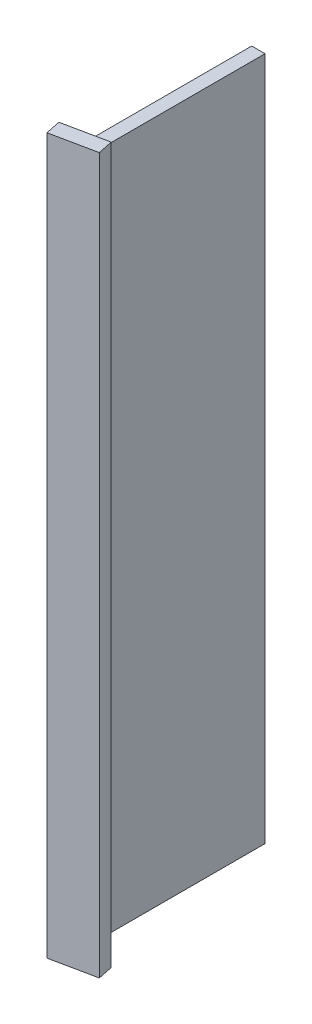
ISO-10303-21;
HEADER;
FILE_DESCRIPTION(('STEP AP214'),'2;1');
FILE_NAME('part.step','',(''),(''),'','','');
FILE_SCHEMA(('AUTOMOTIVE_DESIGN { 1 0 10303 214 1 1 1 1 }'));
ENDSEC;
DATA;
#1=APPLICATION_CONTEXT('core data for automotive mechanical design processes');
#2=APPLICATION_PROTOCOL_DEFINITION('international standard','automotive_design',2000,#1);
#3=PRODUCT_CONTEXT('',#1,'mechanical');
#4=PRODUCT('Part','Part','',(#3));
#5=PRODUCT_RELATED_PRODUCT_CATEGORY('part','',(#4));
#6=PRODUCT_DEFINITION_FORMATION('','',#4);
#7=PRODUCT_DEFINITION_CONTEXT('part definition',#1,'design');
#8=PRODUCT_DEFINITION('design','',#6,#7);
#9=PRODUCT_DEFINITION_SHAPE('','',#8);
#10=(LENGTH_UNIT() NAMED_UNIT(*) SI_UNIT(.MILLI.,.METRE.));
#11=(NAMED_UNIT(*) PLANE_ANGLE_UNIT() SI_UNIT($,.RADIAN.));
#12=(NAMED_UNIT(*) SI_UNIT($,.STERADIAN.) SOLID_ANGLE_UNIT());
#13=UNCERTAINTY_MEASURE_WITH_UNIT(LENGTH_MEASURE(1.E-05),#10,'distance_accuracy_value','');
#14=(GEOMETRIC_REPRESENTATION_CONTEXT(3) GLOBAL_UNCERTAINTY_ASSIGNED_CONTEXT((#13)) GLOBAL_UNIT_ASSIGNED_CONTEXT((#10,
#11,#12)) REPRESENTATION_CONTEXT('',''));
#15=CARTESIAN_POINT('',(0.,0.,0.));
#16=DIRECTION('',(0.,0.,1.));
#17=DIRECTION('',(1.,0.,0.));
#18=AXIS2_PLACEMENT_3D('',#15,#16,#17);
#19=CARTESIAN_POINT('',(0.,0.,0.));
#20=DIRECTION('',(0.,0.,1.));
#21=DIRECTION('',(1.,0.,0.));
#22=AXIS2_PLACEMENT_3D('',#19,#20,#21);
#23=PLANE('',#22);
#24=DIRECTION('',(0.,1.,0.));
#25=VECTOR('',#24,1.);
#26=CARTESIAN_POINT('',(32.67,-8.15000000000002,0.));
#27=LINE('',#26,#25);
#28=CARTESIAN_POINT('',(32.67,-8.15000000000002,0.));
#29=VERTEX_POINT('',#28);
#30=CARTESIAN_POINT('',(32.67,58.6499999999998,0.));
#31=VERTEX_POINT('',#30);
#32=EDGE_CURVE('E124',#29,#31,#27,.T.);
#33=ORIENTED_EDGE('',*,*,#32,.F.);
#34=DIRECTION('',(1.,0.,0.));
#35=VECTOR('',#34,1.);
#36=CARTESIAN_POINT('',(31.37,-8.15000000000002,0.));
#37=LINE('',#36,#35);
#38=CARTESIAN_POINT('',(31.37,-8.15000000000002,0.));
#39=VERTEX_POINT('',#38);
#40=EDGE_CURVE('E142',#39,#29,#37,.T.);
#41=ORIENTED_EDGE('',*,*,#40,.F.);
#42=DIRECTION('',(0.,-1.,0.));
#43=VECTOR('',#42,1.);
#44=CARTESIAN_POINT('',(31.37,58.6499999999998,0.));
#45=LINE('',#44,#43);
#46=CARTESIAN_POINT('',(31.37,58.6499999999998,0.));
#47=VERTEX_POINT('',#46);
#48=EDGE_CURVE('E139',#47,#39,#45,.T.);
#49=ORIENTED_EDGE('',*,*,#48,.F.);
#50=DIRECTION('',(-1.,0.,0.));
#51=VECTOR('',#50,1.);
#52=CARTESIAN_POINT('',(32.67,58.6499999999998,0.));
#53=LINE('',#52,#51);
#54=EDGE_CURVE('E126',#31,#47,#53,.T.);
#55=ORIENTED_EDGE('',*,*,#54,.F.);
#56=EDGE_LOOP('',(#33,#41,#49,#55));
#57=FACE_BOUND('',#56,.T.);
#58=ADVANCED_FACE('F33',(#57),#23,.F.);
#59=CARTESIAN_POINT('',(31.37,-8.15000000000002,84.4459980288886));
#60=DIRECTION('',(0.,1.,0.));
#61=DIRECTION('',(0.,0.,1.));
#62=AXIS2_PLACEMENT_3D('',#59,#60,#61);
#63=PLANE('',#62);
#64=DIRECTION('',(0.,0.,-1.));
#65=VECTOR('',#64,1.);
#66=CARTESIAN_POINT('',(32.67,-8.15000000000002,84.4459980288886));
#67=LINE('',#66,#65);
#68=CARTESIAN_POINT('',(32.67,-8.15000000000002,16.7930773738287));
#69=VERTEX_POINT('',#68);
#70=EDGE_CURVE('E55',#69,#29,#67,.T.);
#71=ORIENTED_EDGE('',*,*,#70,.F.);
#72=DIRECTION('',(-0.979305392290832,0.,0.202388113855779));
#73=VECTOR('',#72,1.);
#74=CARTESIAN_POINT('',(18.0144558360381,-8.15000000000002,19.8218648840617));
#75=LINE('',#74,#73);
#76=CARTESIAN_POINT('',(31.37,-8.15000000000003,17.0617418273113));
#77=VERTEX_POINT('',#76);
#78=EDGE_CURVE('E37',#69,#77,#75,.T.);
#79=ORIENTED_EDGE('',*,*,#78,.T.);
#80=DIRECTION('',(0.,0.,-1.));
#81=VECTOR('',#80,1.);
#82=CARTESIAN_POINT('',(31.37,-8.15000000000002,84.4459980288886));
#83=LINE('',#82,#81);
#84=EDGE_CURVE('E145',#77,#39,#83,.T.);
#85=ORIENTED_EDGE('',*,*,#84,.T.);
#86=ORIENTED_EDGE('',*,*,#40,.T.);
#87=EDGE_LOOP('',(#71,#79,#85,#86));
#88=FACE_BOUND('',#87,.T.);
#89=ADVANCED_FACE('F153',(#88),#63,.F.);
#90=CARTESIAN_POINT('',(31.37,58.6499999999998,84.4459980288886));
#91=DIRECTION('',(1.,0.,0.));
#92=DIRECTION('',(0.,0.,-1.));
#93=AXIS2_PLACEMENT_3D('',#90,#91,#92);
#94=PLANE('',#93);
#95=ORIENTED_EDGE('',*,*,#84,.F.);
#96=DIRECTION('',(0.,1.,0.));
#97=VECTOR('',#96,1.);
#98=CARTESIAN_POINT('',(31.37,58.6499999999998,17.0617418273114));
#99=LINE('',#98,#97);
#100=CARTESIAN_POINT('',(31.37,58.6499999999998,17.0617418273113));
#101=VERTEX_POINT('',#100);
#102=EDGE_CURVE('E132',#77,#101,#99,.T.);
#103=ORIENTED_EDGE('',*,*,#102,.T.);
#104=DIRECTION('',(0.,0.,-1.));
#105=VECTOR('',#104,1.);
#106=CARTESIAN_POINT('',(31.37,58.6499999999998,84.4459980288886));
#107=LINE('',#106,#105);
#108=EDGE_CURVE('E147',#101,#47,#107,.T.);
#109=ORIENTED_EDGE('',*,*,#108,.T.);
#110=ORIENTED_EDGE('',*,*,#48,.T.);
#111=EDGE_LOOP('',(#95,#103,#109,#110));
#112=FACE_BOUND('',#111,.T.);
#113=ADVANCED_FACE('F163',(#112),#94,.F.);
#114=CARTESIAN_POINT('',(32.67,58.6499999999998,84.4459980288886));
#115=DIRECTION('',(0.,-1.,0.));
#116=DIRECTION('',(0.,0.,-1.));
#117=AXIS2_PLACEMENT_3D('',#114,#115,#116);
#118=PLANE('',#117);
#119=ORIENTED_EDGE('',*,*,#108,.F.);
#120=DIRECTION('',(0.979305392290832,0.,-0.202388113855779));
#121=VECTOR('',#120,1.);
#122=CARTESIAN_POINT('',(19.2612066028189,58.6499999999998,19.5642051814568));
#123=LINE('',#122,#121);
#124=CARTESIAN_POINT('',(32.67,58.6499999999998,16.7930773738286));
#125=VERTEX_POINT('',#124);
#126=EDGE_CURVE('E42',#101,#125,#123,.T.);
#127=ORIENTED_EDGE('',*,*,#126,.T.);
#128=DIRECTION('',(0.,0.,-1.));
#129=VECTOR('',#128,1.);
#130=CARTESIAN_POINT('',(32.67,58.6499999999998,84.4459980288886));
#131=LINE('',#130,#129);
#132=EDGE_CURVE('E148',#125,#31,#131,.T.);
#133=ORIENTED_EDGE('',*,*,#132,.T.);
#134=ORIENTED_EDGE('',*,*,#54,.T.);
#135=EDGE_LOOP('',(#119,#127,#133,#134));
#136=FACE_BOUND('',#135,.T.);
#137=ADVANCED_FACE('F160',(#136),#118,.F.);
#138=CARTESIAN_POINT('',(32.67,-8.15000000000002,84.4459980288886));
#139=DIRECTION('',(-1.,0.,0.));
#140=DIRECTION('',(0.,0.,1.));
#141=AXIS2_PLACEMENT_3D('',#138,#139,#140);
#142=PLANE('',#141);
#143=ORIENTED_EDGE('',*,*,#132,.F.);
#144=DIRECTION('',(0.,-1.,0.));
#145=VECTOR('',#144,1.);
#146=CARTESIAN_POINT('',(32.67,-8.15000000000002,16.7930773738287));
#147=LINE('',#146,#145);
#148=EDGE_CURVE('E11',#125,#69,#147,.T.);
#149=ORIENTED_EDGE('',*,*,#148,.T.);
#150=ORIENTED_EDGE('',*,*,#70,.T.);
#151=ORIENTED_EDGE('',*,*,#32,.T.);
#152=EDGE_LOOP('',(#143,#149,#150,#151));
#153=FACE_BOUND('',#152,.T.);
#154=ADVANCED_FACE('F35',(#153),#142,.F.);
#155=CARTESIAN_POINT('',(4.66657828556217,0.,22.5804035204103));
#156=DIRECTION('',(0.202388113855784,0.,0.979305392290831));
#157=DIRECTION('',(0.979305392290831,0.,-0.202388113855784));
#158=AXIS2_PLACEMENT_3D('',#155,#156,#157);
#159=PLANE('',#158);
#160=DIRECTION('',(0.,-1.,0.));
#161=VECTOR('',#160,1.);
#162=CARTESIAN_POINT('',(29.9010419115637,60.1499999999998,17.365323998095));
#163=LINE('',#162,#161);
#164=CARTESIAN_POINT('',(29.9010419115637,60.1499999999998,17.365323998095));
#165=VERTEX_POINT('',#164);
#166=CARTESIAN_POINT('',(29.9010419115637,-9.65000000000002,17.365323998095));
#167=VERTEX_POINT('',#166);
#168=EDGE_CURVE('E123',#165,#167,#163,.T.);
#169=ORIENTED_EDGE('',*,*,#168,.F.);
#170=DIRECTION('',(-0.979305392290831,0.,0.202388113855784));
#171=VECTOR('',#170,1.);
#172=CARTESIAN_POINT('',(34.1389580884362,60.1499999999998,16.4894952030449));
#173=LINE('',#172,#171);
#174=CARTESIAN_POINT('',(34.1389580884362,60.1499999999998,16.4894952030449));
#175=VERTEX_POINT('',#174);
#176=EDGE_CURVE('E119',#175,#165,#173,.T.);
#177=ORIENTED_EDGE('',*,*,#176,.F.);
#178=DIRECTION('',(0.,1.,0.));
#179=VECTOR('',#178,1.);
#180=CARTESIAN_POINT('',(34.1389580884362,-9.65000000000002,16.4894952030449));
#181=LINE('',#180,#179);
#182=CARTESIAN_POINT('',(34.1389580884362,-9.65000000000002,16.4894952030449));
#183=VERTEX_POINT('',#182);
#184=EDGE_CURVE('E259',#183,#175,#181,.T.);
#185=ORIENTED_EDGE('',*,*,#184,.F.);
#186=DIRECTION('',(0.979305392290831,0.,-0.202388113855784));
#187=VECTOR('',#186,1.);
#188=CARTESIAN_POINT('',(29.9010419115637,-9.65000000000002,17.365323998095));
#189=LINE('',#188,#187);
#190=EDGE_CURVE('E257',#167,#183,#189,.T.);
#191=ORIENTED_EDGE('',*,*,#190,.F.);
#192=EDGE_LOOP('',(#169,#177,#185,#191));
#193=FACE_BOUND('',#192,.T.);
#194=ORIENTED_EDGE('',*,*,#102,.F.);
#195=ORIENTED_EDGE('',*,*,#78,.F.);
#196=ORIENTED_EDGE('',*,*,#148,.F.);
#197=ORIENTED_EDGE('',*,*,#126,.F.);
#198=EDGE_LOOP('',(#194,#195,#196,#197));
#199=FACE_BOUND('',#198,.T.);
#200=ADVANCED_FACE('F161',(#193,#199),#159,.F.);
#201=CARTESIAN_POINT('',(30.2046240823474,60.1499999999998,18.8342820865313));
#202=DIRECTION('',(0.979305392290831,0.,-0.202388113855783));
#203=DIRECTION('',(-0.202388113855783,0.,-0.979305392290831));
#204=AXIS2_PLACEMENT_3D('',#201,#202,#203);
#205=PLANE('',#204);
#206=ORIENTED_EDGE('',*,*,#168,.T.);
#207=DIRECTION('',(-0.202388113855783,0.,-0.979305392290831));
#208=VECTOR('',#207,1.);
#209=CARTESIAN_POINT('',(30.2046240823474,-9.65000000000002,18.8342820865313));
#210=LINE('',#209,#208);
#211=CARTESIAN_POINT('',(30.2046240823474,-9.65000000000002,18.8342820865313));
#212=VERTEX_POINT('',#211);
#213=EDGE_CURVE('E103',#212,#167,#210,.T.);
#214=ORIENTED_EDGE('',*,*,#213,.F.);
#215=DIRECTION('',(0.,-1.,0.));
#216=VECTOR('',#215,1.);
#217=CARTESIAN_POINT('',(30.2046240823474,60.1499999999998,18.8342820865313));
#218=LINE('',#217,#216);
#219=CARTESIAN_POINT('',(30.2046240823474,60.1499999999998,18.8342820865313));
#220=VERTEX_POINT('',#219);
#221=EDGE_CURVE('E110',#220,#212,#218,.T.);
#222=ORIENTED_EDGE('',*,*,#221,.F.);
#223=DIRECTION('',(-0.202388113855783,0.,-0.979305392290831));
#224=VECTOR('',#223,1.);
#225=CARTESIAN_POINT('',(30.2046240823474,60.1499999999998,18.8342820865313));
#226=LINE('',#225,#224);
#227=EDGE_CURVE('E266',#220,#165,#226,.T.);
#228=ORIENTED_EDGE('',*,*,#227,.T.);
#229=EDGE_LOOP('',(#206,#214,#222,#228));
#230=FACE_BOUND('',#229,.T.);
#231=ADVANCED_FACE('F121',(#230),#205,.F.);
#232=CARTESIAN_POINT('',(30.2046240823474,-9.65000000000002,18.8342820865313));
#233=DIRECTION('',(0.,1.,0.));
#234=DIRECTION('',(0.,0.,1.));
#235=AXIS2_PLACEMENT_3D('',#232,#233,#234);
#236=PLANE('',#235);
#237=ORIENTED_EDGE('',*,*,#190,.T.);
#238=DIRECTION('',(-0.202388113855783,0.,-0.979305392290831));
#239=VECTOR('',#238,1.);
#240=CARTESIAN_POINT('',(34.4425402592199,-9.65000000000002,17.9584532914812));
#241=LINE('',#240,#239);
#242=CARTESIAN_POINT('',(34.4425402592199,-9.65000000000002,17.9584532914812));
#243=VERTEX_POINT('',#242);
#244=EDGE_CURVE('E106',#243,#183,#241,.T.);
#245=ORIENTED_EDGE('',*,*,#244,.F.);
#246=DIRECTION('',(0.979305392290831,0.,-0.202388113855784));
#247=VECTOR('',#246,1.);
#248=CARTESIAN_POINT('',(30.2046240823474,-9.65000000000002,18.8342820865313));
#249=LINE('',#248,#247);
#250=EDGE_CURVE('E99',#212,#243,#249,.T.);
#251=ORIENTED_EDGE('',*,*,#250,.F.);
#252=ORIENTED_EDGE('',*,*,#213,.T.);
#253=EDGE_LOOP('',(#237,#245,#251,#252));
#254=FACE_BOUND('',#253,.T.);
#255=ADVANCED_FACE('F101',(#254),#236,.F.);
#256=CARTESIAN_POINT('',(34.4425402592199,-9.65000000000002,17.9584532914812));
#257=DIRECTION('',(-0.979305392290831,0.,0.202388113855783));
#258=DIRECTION('',(0.202388113855783,0.,0.979305392290831));
#259=AXIS2_PLACEMENT_3D('',#256,#257,#258);
#260=PLANE('',#259);
#261=ORIENTED_EDGE('',*,*,#184,.T.);
#262=DIRECTION('',(-0.202388113855783,0.,-0.979305392290831));
#263=VECTOR('',#262,1.);
#264=CARTESIAN_POINT('',(34.4425402592199,60.1499999999998,17.9584532914812));
#265=LINE('',#264,#263);
#266=CARTESIAN_POINT('',(34.4425402592199,60.1499999999998,17.9584532914812));
#267=VERTEX_POINT('',#266);
#268=EDGE_CURVE('E128',#267,#175,#265,.T.);
#269=ORIENTED_EDGE('',*,*,#268,.F.);
#270=DIRECTION('',(0.,1.,0.));
#271=VECTOR('',#270,1.);
#272=CARTESIAN_POINT('',(34.4425402592199,-9.65000000000002,17.9584532914812));
#273=LINE('',#272,#271);
#274=EDGE_CURVE('E109',#243,#267,#273,.T.);
#275=ORIENTED_EDGE('',*,*,#274,.F.);
#276=ORIENTED_EDGE('',*,*,#244,.T.);
#277=EDGE_LOOP('',(#261,#269,#275,#276));
#278=FACE_BOUND('',#277,.T.);
#279=ADVANCED_FACE('F180',(#278),#260,.F.);
#280=CARTESIAN_POINT('',(34.4425402592199,60.1499999999998,17.9584532914812));
#281=DIRECTION('',(0.,-1.,0.));
#282=DIRECTION('',(0.,0.,-1.));
#283=AXIS2_PLACEMENT_3D('',#280,#281,#282);
#284=PLANE('',#283);
#285=ORIENTED_EDGE('',*,*,#176,.T.);
#286=ORIENTED_EDGE('',*,*,#227,.F.);
#287=DIRECTION('',(-0.979305392290831,0.,0.202388113855784));
#288=VECTOR('',#287,1.);
#289=CARTESIAN_POINT('',(34.4425402592199,60.1499999999998,17.9584532914812));
#290=LINE('',#289,#288);
#291=EDGE_CURVE('E115',#267,#220,#290,.T.);
#292=ORIENTED_EDGE('',*,*,#291,.F.);
#293=ORIENTED_EDGE('',*,*,#268,.T.);
#294=EDGE_LOOP('',(#285,#286,#292,#293));
#295=FACE_BOUND('',#294,.T.);
#296=ADVANCED_FACE('F183',(#295),#284,.F.);
#297=CARTESIAN_POINT('',(4.97016045634585,0.,24.0493616088465));
#298=DIRECTION('',(0.202388113855784,0.,0.979305392290831));
#299=DIRECTION('',(0.979305392290831,0.,-0.202388113855784));
#300=AXIS2_PLACEMENT_3D('',#297,#298,#299);
#301=PLANE('',#300);
#302=ORIENTED_EDGE('',*,*,#221,.T.);
#303=ORIENTED_EDGE('',*,*,#250,.T.);
#304=ORIENTED_EDGE('',*,*,#274,.T.);
#305=ORIENTED_EDGE('',*,*,#291,.T.);
#306=EDGE_LOOP('',(#302,#303,#304,#305));
#307=FACE_BOUND('',#306,.T.);
#308=ADVANCED_FACE('F113',(#307),#301,.T.);
#309=CLOSED_SHELL('',(#58,#89,#113,#137,#154,#200,#231,#255,#279,#296,#308));
#310=MANIFOLD_SOLID_BREP('B2',#309);
#311=ADVANCED_BREP_SHAPE_REPRESENTATION('',(#18,#310),#14);
#312=SHAPE_DEFINITION_REPRESENTATION(#9,#311);
ENDSEC;
END-ISO-10303-21;
